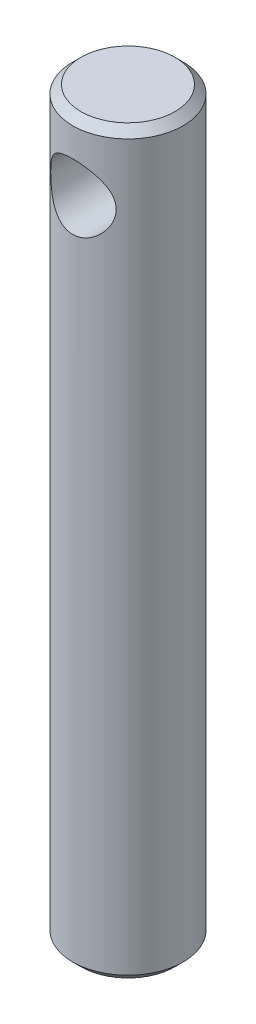
ISO-10303-21;
HEADER;
FILE_DESCRIPTION(('STEP AP214'),'2;1');
FILE_NAME('part.step','',(''),(''),'','','');
FILE_SCHEMA(('AUTOMOTIVE_DESIGN { 1 0 10303 214 1 1 1 1 }'));
ENDSEC;
DATA;
#1=APPLICATION_CONTEXT('core data for automotive mechanical design processes');
#2=APPLICATION_PROTOCOL_DEFINITION('international standard','automotive_design',2000,#1);
#3=PRODUCT_CONTEXT('',#1,'mechanical');
#4=PRODUCT('Part','Part','',(#3));
#5=PRODUCT_RELATED_PRODUCT_CATEGORY('part','',(#4));
#6=PRODUCT_DEFINITION_FORMATION('','',#4);
#7=PRODUCT_DEFINITION_CONTEXT('part definition',#1,'design');
#8=PRODUCT_DEFINITION('design','',#6,#7);
#9=PRODUCT_DEFINITION_SHAPE('','',#8);
#10=(LENGTH_UNIT() NAMED_UNIT(*) SI_UNIT(.MILLI.,.METRE.));
#11=(NAMED_UNIT(*) PLANE_ANGLE_UNIT() SI_UNIT($,.RADIAN.));
#12=(NAMED_UNIT(*) SI_UNIT($,.STERADIAN.) SOLID_ANGLE_UNIT());
#13=UNCERTAINTY_MEASURE_WITH_UNIT(LENGTH_MEASURE(1.E-05),#10,'distance_accuracy_value','');
#14=(GEOMETRIC_REPRESENTATION_CONTEXT(3) GLOBAL_UNCERTAINTY_ASSIGNED_CONTEXT((#13)) GLOBAL_UNIT_ASSIGNED_CONTEXT((#10,
#11,#12)) REPRESENTATION_CONTEXT('',''));
#15=CARTESIAN_POINT('',(0.,0.,0.));
#16=DIRECTION('',(0.,0.,1.));
#17=DIRECTION('',(1.,0.,0.));
#18=AXIS2_PLACEMENT_3D('',#15,#16,#17);
#19=CARTESIAN_POINT('',(0.,181.,0.));
#20=DIRECTION('',(0.,-1.,0.));
#21=DIRECTION('',(0.,0.,-1.));
#22=AXIS2_PLACEMENT_3D('',#19,#20,#21);
#23=CYLINDRICAL_SURFACE('',#22,13.5);
#24=CARTESIAN_POINT('',(0.,179.,0.));
#25=DIRECTION('',(0.,1.,0.));
#26=DIRECTION('',(0.,0.,1.));
#27=AXIS2_PLACEMENT_3D('',#24,#25,#26);
#28=CIRCLE('',#27,13.5);
#29=CARTESIAN_POINT('',(0.,179.,13.5));
#30=VERTEX_POINT('',#29);
#31=EDGE_CURVE('E38',#30,#30,#28,.F.);
#32=ORIENTED_EDGE('',*,*,#31,.T.);
#33=EDGE_LOOP('',(#32));
#34=FACE_BOUND('',#33,.T.);
#35=CARTESIAN_POINT('',(0.,2.00000000000003,0.));
#36=DIRECTION('',(0.,1.,0.));
#37=DIRECTION('',(0.,0.,1.));
#38=AXIS2_PLACEMENT_3D('',#35,#36,#37);
#39=CIRCLE('',#38,13.5);
#40=CARTESIAN_POINT('',(0.,2.00000000000003,13.5));
#41=VERTEX_POINT('',#40);
#42=EDGE_CURVE('E42',#41,#41,#39,.T.);
#43=ORIENTED_EDGE('',*,*,#42,.T.);
#44=EDGE_LOOP('',(#43));
#45=FACE_BOUND('',#44,.T.);
#46=CARTESIAN_POINT('',(0.,172.,-13.5));
#47=CARTESIAN_POINT('',(-0.205122931176953,171.999998343756,-13.4999984706654));
#48=CARTESIAN_POINT('',(-0.41030968731953,171.992098137591,-13.4953127723332));
#49=CARTESIAN_POINT('',(-0.819141753344273,171.960595967104,-13.4766810212997));
#50=CARTESIAN_POINT('',(-1.02278601232819,171.936984128209,-13.4627291449269));
#51=CARTESIAN_POINT('',(-1.42728944357704,171.874313427976,-13.4258768138681));
#52=CARTESIAN_POINT('',(-1.6281421212592,171.835223299433,-13.4029582469779));
#53=CARTESIAN_POINT('',(-2.02526903490091,171.742086703841,-13.3487255680575));
#54=CARTESIAN_POINT('',(-2.22154127118509,171.688033832243,-13.3174078610974));
#55=CARTESIAN_POINT('',(-2.60710044914416,171.56595647582,-13.2473097212851));
#56=CARTESIAN_POINT('',(-2.796419526404,171.49800942811,-13.2085707223819));
#57=CARTESIAN_POINT('',(-3.16819309454816,171.348653371793,-13.1243629595229));
#58=CARTESIAN_POINT('',(-3.35064490164154,171.267239165798,-13.0788915980566));
#59=CARTESIAN_POINT('',(-3.70759632054505,171.091773017542,-12.9822141132811));
#60=CARTESIAN_POINT('',(-3.88210196567982,170.997730885075,-12.9310124465547));
#61=CARTESIAN_POINT('',(-4.22262062146871,170.797683998483,-12.8238603317318));
#62=CARTESIAN_POINT('',(-4.38863046858383,170.691674834685,-12.7679081350303));
#63=CARTESIAN_POINT('',(-4.89718414110189,170.339996691162,-12.5858330445618));
#64=CARTESIAN_POINT('',(-5.22341790700595,170.07380246969,-12.4529468182507));
#65=CARTESIAN_POINT('',(-5.82936656276921,169.494946649173,-12.1810937765254));
#66=CARTESIAN_POINT('',(-6.10902175775847,169.182226379139,-12.0421194422138));
#67=CARTESIAN_POINT('',(-6.50520782052547,168.662327776831,-11.8303992839742));
#68=CARTESIAN_POINT('',(-6.63936720209023,168.469263745104,-11.7554216876498));
#69=CARTESIAN_POINT('',(-6.89086522885866,168.070807118774,-11.609783433664));
#70=CARTESIAN_POINT('',(-7.00820120063712,167.865412572059,-11.5391234631425));
#71=CARTESIAN_POINT('',(-7.22484399489973,167.443515156213,-11.4047302769881));
#72=CARTESIAN_POINT('',(-7.32417406468948,167.227027080084,-11.3409881730563));
#73=CARTESIAN_POINT('',(-7.50381963098545,166.783846649798,-11.222934423756));
#74=CARTESIAN_POINT('',(-7.58414199724749,166.557158017684,-11.1686193731639));
#75=CARTESIAN_POINT('',(-7.70795943714298,166.14973876555,-11.0833927077012));
#76=CARTESIAN_POINT('',(-7.75567185156902,165.970802408651,-11.0499835537045));
#77=CARTESIAN_POINT('',(-7.83876309883677,165.608806310971,-10.991196056065));
#78=CARTESIAN_POINT('',(-7.87414459111242,165.425747468372,-10.9658159808844));
#79=CARTESIAN_POINT('',(-7.93208960481248,165.056783615112,-10.9239752592024));
#80=CARTESIAN_POINT('',(-7.95466580537517,164.87088160762,-10.9075057906269));
#81=CARTESIAN_POINT('',(-7.98672547282611,164.497345023897,-10.8840532203254));
#82=CARTESIAN_POINT('',(-7.9962087034115,164.309710416457,-10.8770702898131));
#83=CARTESIAN_POINT('',(-8.00193828874021,163.93379097889,-10.8728559818045));
#84=CARTESIAN_POINT('',(-7.99816084764291,163.745505586187,-10.8756421345971));
#85=CARTESIAN_POINT('',(-7.97737627294427,163.370065949334,-10.8908967202689));
#86=CARTESIAN_POINT('',(-7.96036907765031,163.182911710462,-10.9033651982984));
#87=CARTESIAN_POINT('',(-7.91337303541688,162.811019662174,-10.9375210319713));
#88=CARTESIAN_POINT('',(-7.88337852601511,162.626282943032,-10.9592124087194));
#89=CARTESIAN_POINT('',(-7.81080898822978,162.260442530172,-11.0110510917449));
#90=CARTESIAN_POINT('',(-7.76822883364468,162.079340348982,-11.041201843317));
#91=CARTESIAN_POINT('',(-7.67153392214045,161.723788188133,-11.1086001105235));
#92=CARTESIAN_POINT('',(-7.61754951032849,161.549287312154,-11.1457669635967));
#93=CARTESIAN_POINT('',(-7.49830790922819,161.205633614546,-11.2263329483964));
#94=CARTESIAN_POINT('',(-7.43304703041514,161.036482564811,-11.2697341191304));
#95=CARTESIAN_POINT('',(-7.22117432928156,160.538074590643,-11.4075872311667));
#96=CARTESIAN_POINT('',(-7.05842398146661,160.21768715253,-11.5097240115744));
#97=CARTESIAN_POINT('',(-6.66247402643238,159.551838280788,-11.7440543621879));
#98=CARTESIAN_POINT('',(-6.42198486582338,159.211467447191,-11.878400495209));
#99=CARTESIAN_POINT('',(-6.02466132616968,158.732497566782,-12.0820427711885));
#100=CARTESIAN_POINT('',(-5.8860016140811,158.57799915745,-12.1503304832045));
#101=CARTESIAN_POINT('',(-5.59686531747621,158.280018656814,-12.28619478169));
#102=CARTESIAN_POINT('',(-5.44638665906638,158.13653850768,-12.353771240985));
#103=CARTESIAN_POINT('',(-5.11342266365443,157.843012578185,-12.4955936502826));
#104=CARTESIAN_POINT('',(-4.92934072005561,157.694625523672,-12.5695334520902));
#105=CARTESIAN_POINT('',(-4.54760991273903,157.414005009921,-12.7126224432407));
#106=CARTESIAN_POINT('',(-4.34996643209304,157.281765198526,-12.7817735117576));
#107=CARTESIAN_POINT('',(-3.94205841605495,157.034583098467,-12.9134074362129));
#108=CARTESIAN_POINT('',(-3.73179575996589,156.91963824306,-12.9758912812324));
#109=CARTESIAN_POINT('',(-3.29988979614193,156.708326471527,-13.0923920961945));
#110=CARTESIAN_POINT('',(-3.07824791157265,156.611957239337,-13.1464101215234));
#111=CARTESIAN_POINT('',(-2.63989262491529,156.444712590565,-13.2411455573001));
#112=CARTESIAN_POINT('',(-2.42379373851599,156.37258808913,-13.2824988684139));
#113=CARTESIAN_POINT('',(-1.98464521869016,156.246720575252,-13.3551749407203));
#114=CARTESIAN_POINT('',(-1.76159580134516,156.192976991994,-13.3864980133972));
#115=CARTESIAN_POINT('',(-1.31067843201882,156.104757850273,-13.4381386306378));
#116=CARTESIAN_POINT('',(-1.08281526319762,156.070264020151,-13.4584666110582));
#117=CARTESIAN_POINT('',(-0.624238580697285,156.021060133653,-13.4875157829987));
#118=CARTESIAN_POINT('',(-0.393525449189458,156.006347453135,-13.4962385140549));
#119=CARTESIAN_POINT('',(0.0378766724428281,155.997576776386,-13.5014361348051));
#120=CARTESIAN_POINT('',(0.238502954909073,156.001045490512,-13.4993776671767));
#121=CARTESIAN_POINT('',(0.638640809631498,156.023015763461,-13.4863707718972));
#122=CARTESIAN_POINT('',(0.83815241341006,156.041516894989,-13.4754225969356));
#123=CARTESIAN_POINT('',(1.23455794778156,156.093305143134,-13.4449019138791));
#124=CARTESIAN_POINT('',(1.43145203899232,156.126591348145,-13.4253299375047));
#125=CARTESIAN_POINT('',(1.8212613679895,156.207526758632,-13.3780253653781));
#126=CARTESIAN_POINT('',(2.01417650025616,156.255176344495,-13.3502925535022));
#127=CARTESIAN_POINT('',(2.39085762808705,156.363156275801,-13.287944824429));
#128=CARTESIAN_POINT('',(2.57473032701229,156.423203983128,-13.2534841015468));
#129=CARTESIAN_POINT('',(2.93650337424314,156.555933754035,-13.1780558295579));
#130=CARTESIAN_POINT('',(3.11440174298448,156.628619956985,-13.1370861490134));
#131=CARTESIAN_POINT('',(3.63772021230858,156.864649779632,-13.0056152632673));
#132=CARTESIAN_POINT('',(3.97303694654272,157.046043984512,-12.9065051976664));
#133=CARTESIAN_POINT('',(4.64414667633845,157.472644541888,-12.6814886425768));
#134=CARTESIAN_POINT('',(4.97635388183319,157.72252860721,-12.5538665397381));
#135=CARTESIAN_POINT('',(5.59683667009505,158.268822776691,-12.2897974702756));
#136=CARTESIAN_POINT('',(5.88506021395217,158.565287163469,-12.1533403181474));
#137=CARTESIAN_POINT('',(6.29750224230009,159.060824047299,-11.9423385209066));
#138=CARTESIAN_POINT('',(6.43837099779288,159.245881454074,-11.8667829553649));
#139=CARTESIAN_POINT('',(6.70403303829135,159.628483436868,-11.7187468487953));
#140=CARTESIAN_POINT('',(6.82882379796972,159.826029967273,-11.6462667920254));
#141=CARTESIAN_POINT('',(7.06125094454739,160.232570680755,-11.506828543792));
#142=CARTESIAN_POINT('',(7.16890262366968,160.441554432744,-11.4398654558908));
#143=CARTESIAN_POINT('',(7.36611990231878,160.87016326196,-11.3138841290262));
#144=CARTESIAN_POINT('',(7.45569130340101,161.089784897592,-11.254863343589));
#145=CARTESIAN_POINT('',(7.59831555682667,161.489927623979,-11.1589116515974));
#146=CARTESIAN_POINT('',(7.6550774522513,161.668649814471,-11.1199628798627));
#147=CARTESIAN_POINT('',(7.75617019210318,162.030949498007,-11.0496885843208));
#148=CARTESIAN_POINT('',(7.80050860145053,162.214523961541,-11.0183584229255));
#149=CARTESIAN_POINT('',(7.87621469797195,162.585421878416,-10.9643699469353));
#150=CARTESIAN_POINT('',(7.90759396053869,162.772741828694,-10.9417038947219));
#151=CARTESIAN_POINT('',(7.95699523265756,163.150046162119,-10.9058316583184));
#152=CARTESIAN_POINT('',(7.97501712893094,163.340030567848,-10.8926255543545));
#153=CARTESIAN_POINT('',(7.99745812033671,163.721867736,-10.8761602279497));
#154=CARTESIAN_POINT('',(8.0018321124445,163.913724595854,-10.8729339868456));
#155=CARTESIAN_POINT('',(7.996778112766,164.297156559766,-10.8766515466055));
#156=CARTESIAN_POINT('',(7.98735008406233,164.488731663069,-10.8835953746723));
#157=CARTESIAN_POINT('',(7.95483727212307,164.870187875616,-10.9073812508997));
#158=CARTESIAN_POINT('',(7.93174562421614,165.060068084629,-10.9242282744479));
#159=CARTESIAN_POINT('',(7.87225290532894,165.436655864536,-10.9671771278067));
#160=CARTESIAN_POINT('',(7.8358517253291,165.62336340943,-10.9932790334249));
#161=CARTESIAN_POINT('',(7.75194341298969,165.985057252961,-11.0525969465292));
#162=CARTESIAN_POINT('',(7.70493742499578,166.160213974115,-11.08548750366));
#163=CARTESIAN_POINT('',(7.59961179114273,166.505702153153,-11.1579558738974));
#164=CARTESIAN_POINT('',(7.54128831449775,166.676031954767,-11.1975359507106));
#165=CARTESIAN_POINT('',(7.35014402665028,167.178647907142,-11.3247003980992));
#166=CARTESIAN_POINT('',(7.20110593141274,167.50274480264,-11.4207410887993));
#167=CARTESIAN_POINT('',(6.83759533101134,168.173054345092,-11.6425574956993));
#168=CARTESIAN_POINT('',(6.61656952026615,168.514942501525,-11.7706347614511));
#169=CARTESIAN_POINT('',(6.24942221440434,168.998577087836,-11.9672101055936));
#170=CARTESIAN_POINT('',(6.12100398845157,169.155020281687,-12.0335258078162));
#171=CARTESIAN_POINT('',(5.85266870926556,169.457762676791,-12.1662915906787));
#172=CARTESIAN_POINT('',(5.71274980853131,169.604060241233,-12.2327416912298));
#173=CARTESIAN_POINT('',(5.39961220618118,169.907515499742,-12.3744932154749));
#174=CARTESIAN_POINT('',(5.22457710182641,170.062899085935,-12.4495896248399));
#175=CARTESIAN_POINT('',(4.86068650491977,170.358351172896,-12.5961177516525));
#176=CARTESIAN_POINT('',(4.67183545178349,170.498424557454,-12.6675506338437));
#177=CARTESIAN_POINT('',(4.28098686300632,170.762305913232,-12.8049241695868));
#178=CARTESIAN_POINT('',(4.07898067749008,170.886103017518,-12.8708611431256));
#179=CARTESIAN_POINT('',(3.66302585983883,171.116087339016,-12.9953588122696));
#180=CARTESIAN_POINT('',(3.44907886127284,171.222276957175,-13.0539205133004));
#181=CARTESIAN_POINT('',(3.01899528399244,171.412069673333,-13.1598943889411));
#182=CARTESIAN_POINT('',(2.80325651083393,171.496382150513,-13.2076477255457));
#183=CARTESIAN_POINT('',(2.3635401937516,171.646411905496,-13.2933751193557));
#184=CARTESIAN_POINT('',(2.13956422012373,171.712132706965,-13.3313510295467));
#185=CARTESIAN_POINT('',(1.6859447781057,171.823808893193,-13.3962654258179));
#186=CARTESIAN_POINT('',(1.45632169501933,171.869826733885,-13.4232387755874));
#187=CARTESIAN_POINT('',(0.99299642917018,171.941588156701,-13.4654361798352));
#188=CARTESIAN_POINT('',(0.759297932027849,171.967349175702,-13.4806703390683));
#189=CARTESIAN_POINT('',(0.437483109511527,171.988509304819,-13.49319343359));
#190=CARTESIAN_POINT('',(0.350067216041171,171.99281650967,-13.4957441886123));
#191=CARTESIAN_POINT('',(0.175104760066545,171.998562242503,-13.4991478170144));
#192=CARTESIAN_POINT('',(0.0875581947125264,172.00000070698,-13.5000006528074));
#193=CARTESIAN_POINT('',(0.,172.,-13.5));
#194=B_SPLINE_CURVE_WITH_KNOTS('',3,(#46,#47,#48,#49,#50,#51,#52,#53,#54,#55,#56,#57,#58,#59,
#60,#61,#62,#63,#64,#65,#66,#67,#68,#69,#70,#71,#72,#73,#74,#75,#76,#77,#78,#79,#80,#81,#82,#83,
#84,#85,#86,#87,#88,#89,#90,#91,#92,#93,#94,#95,#96,#97,#98,#99,#100,#101,#102,#103,#104,#105,
#106,#107,#108,#109,#110,#111,#112,#113,#114,#115,#116,#117,#118,#119,#120,#121,#122,#123,#124,
#125,#126,#127,#128,#129,#130,#131,#132,#133,#134,#135,#136,#137,#138,#139,#140,#141,#142,#143,
#144,#145,#146,#147,#148,#149,#150,#151,#152,#153,#154,#155,#156,#157,#158,#159,#160,#161,#162,
#163,#164,#165,#166,#167,#168,#169,#170,#171,#172,#173,#174,#175,#176,#177,#178,#179,#180,#181,
#182,#183,#184,#185,#186,#187,#188,#189,#190,#191,#192,#193),.UNSPECIFIED.,.T.,.F.,(4,2,2,2,2,2,
2,2,2,2,2,2,2,2,2,2,2,2,2,2,2,2,2,2,2,2,2,2,2,2,2,2,2,2,2,2,2,2,2,2,2,2,2,2,2,2,2,2,2,2,2,2,2,2,
2,2,2,2,2,2,2,2,2,2,2,2,2,2,2,2,2,2,2,4),(0.,0.615275484959753,1.2309380288884,1.84785065057618,
2.46502774062068,3.07885451234465,3.69291873363487,4.30650865972086,4.92032542722164,
6.2393614559817,7.56007515979932,8.29959614649735,9.03923452128919,9.77791104447759,
10.5163201863829,11.0802870514803,11.6441322093692,12.2074180979311,12.7707141525833,
13.3350215398412,13.899331558577,14.4638878643332,15.0286744345495,15.5873248189246,
16.1461583343158,17.2632738786723,18.5715457407466,19.226685801289,19.8819410784707,
20.6242194231251,21.3662048159257,22.1080799818841,22.849862588722,23.5434781118216,
24.2370720929322,24.9300065974601,25.6228491690924,26.2241032615038,26.8253402638966,
27.4265402008261,28.0277560607945,28.6165378710193,29.2055128839596,30.3826068702004,
31.6822635868828,32.9834462549485,33.7163353828148,34.449339483624,35.1816858564231,
35.9137968608352,36.4877987881715,37.0614504303847,37.6345885603748,38.2077315508767,
38.7827666451384,39.3578032774961,39.933129056755,40.508459548665,41.0608316518111,
41.6133910510986,42.7179397420538,43.9932133815707,44.6317328260275,45.2703550452832,
46.0068938813791,46.7431970796167,47.4799894044086,48.2166811778527,48.9251533770453,
49.6334912099232,50.3395667710115,51.0450338817081,51.3076628226638,51.5702975773684),.UNSPECIFIED.);
#195=CARTESIAN_POINT('',(0.,172.,-13.5));
#196=VERTEX_POINT('',#195);
#197=EDGE_CURVE('E51',#196,#196,#194,.T.);
#198=ORIENTED_EDGE('',*,*,#197,.T.);
#199=EDGE_LOOP('',(#198));
#200=FACE_BOUND('',#199,.T.);
#201=CARTESIAN_POINT('',(8.00000000000001,164.,10.8742815854658));
#202=CARTESIAN_POINT('',(8.00000066972052,163.79812704354,10.8742806182195));
#203=CARTESIAN_POINT('',(7.99234765156945,163.596261882585,10.8799236092202));
#204=CARTESIAN_POINT('',(7.9618767460872,163.194306900145,10.9022416615778));
#205=CARTESIAN_POINT('',(7.93905932909489,162.994217023794,10.9189163807748));
#206=CARTESIAN_POINT('',(7.8786220567898,162.59726566884,10.9626044886695));
#207=CARTESIAN_POINT('',(7.84098902590663,162.400407226732,10.9896270791748));
#208=CARTESIAN_POINT('',(7.75149354207312,162.011489183875,11.0529337378418));
#209=CARTESIAN_POINT('',(7.69963048168376,161.819429788364,11.0892182013616));
#210=CARTESIAN_POINT('',(7.58277091402705,161.442616047927,11.1694477063965));
#211=CARTESIAN_POINT('',(7.51787344274849,161.257818482169,11.2133346573902));
#212=CARTESIAN_POINT('',(7.37537290766848,160.894856217774,11.3075714777897));
#213=CARTESIAN_POINT('',(7.29776487969247,160.716694144164,11.3579238706415));
#214=CARTESIAN_POINT('',(7.04689046357688,160.193297536408,11.5165294322246));
#215=CARTESIAN_POINT('',(6.85549612730818,159.858905864772,11.6323867756658));
#216=CARTESIAN_POINT('',(6.40338137662063,159.185411262126,11.8878805091604));
#217=CARTESIAN_POINT('',(6.13712303966875,158.850478148087,12.0287061960164));
#218=CARTESIAN_POINT('',(5.70026551841605,158.382833652492,12.238596600125));
#219=CARTESIAN_POINT('',(5.54828398649881,158.232653451382,12.30838287456));
#220=CARTESIAN_POINT('',(5.23223995619098,157.944474498362,12.4460168052709));
#221=CARTESIAN_POINT('',(5.06817537137077,157.806477859324,12.5138641239187));
#222=CARTESIAN_POINT('',(4.71078077135598,157.529694730334,12.6530264824128));
#223=CARTESIAN_POINT('',(4.51618624394189,157.39234424597,12.7239585619106));
#224=CARTESIAN_POINT('',(4.11404786927373,157.134754835067,12.8596115402171));
#225=CARTESIAN_POINT('',(3.90650982369292,157.014508320187,12.9243351892788));
#226=CARTESIAN_POINT('',(3.47967167743079,156.792383391821,13.0457307108672));
#227=CARTESIAN_POINT('',(3.26037650231535,156.690497363164,13.1024059194772));
#228=CARTESIAN_POINT('',(2.81147420129086,156.506373608097,13.2060077355363));
#229=CARTESIAN_POINT('',(2.58186872600857,156.424132749824,13.2529358967187));
#230=CARTESIAN_POINT('',(2.13613591346709,156.287278218098,13.331663463081));
#231=CARTESIAN_POINT('',(1.92075815409438,156.230799328474,13.3644676910051));
#232=CARTESIAN_POINT('',(1.48477800210823,156.135828562779,13.4198994564764));
#233=CARTESIAN_POINT('',(1.2641759075851,156.097335663049,13.4425275731869));
#234=CARTESIAN_POINT('',(0.819850673621884,156.038968889252,13.476923262792));
#235=CARTESIAN_POINT('',(0.596130033507574,156.019080887432,13.4886990763538));
#236=CARTESIAN_POINT('',(0.147508331015898,155.998209643094,13.5010582768779));
#237=CARTESIAN_POINT('',(-0.0773926134354512,155.997224546618,13.5016427614625));
#238=CARTESIAN_POINT('',(-0.498981178808983,156.013137267787,13.4922181317775));
#239=CARTESIAN_POINT('',(-0.695783248493347,156.027881250192,13.4834849070384));
#240=CARTESIAN_POINT('',(-1.08721419571641,156.071775353704,13.4575789196586));
#241=CARTESIAN_POINT('',(-1.28184308034781,156.100925427779,13.4404061845703));
#242=CARTESIAN_POINT('',(-1.66756943769057,156.173268843967,13.3980171261845));
#243=CARTESIAN_POINT('',(-1.85866695777902,156.216461997532,13.372800910882));
#244=CARTESIAN_POINT('',(-2.2361234588293,156.316389220463,13.314887101475));
#245=CARTESIAN_POINT('',(-2.42248224563113,156.373123843679,13.2821892013707));
#246=CARTESIAN_POINT('',(-2.79057204079765,156.499944331085,13.2097730947892));
#247=CARTESIAN_POINT('',(-2.97226587515725,156.570113180647,13.1700113701964));
#248=CARTESIAN_POINT('',(-3.32888629912084,156.722899320055,13.0844259940756));
#249=CARTESIAN_POINT('',(-3.50381060615085,156.805520763535,13.0386003205079));
#250=CARTESIAN_POINT('',(-4.01716303753443,157.071028634323,12.89335404919));
#251=CARTESIAN_POINT('',(-4.34441275526407,157.271642979083,12.7861147782938));
#252=CARTESIAN_POINT('',(-5.00040625183952,157.740807442118,12.5452081962363));
#253=CARTESIAN_POINT('',(-5.32478086132632,158.014577588094,12.4099157432865));
#254=CARTESIAN_POINT('',(-5.92590775019196,158.609043121832,12.1343708755145));
#255=CARTESIAN_POINT('',(-6.20259615183106,158.929800403741,11.9941121064637));
#256=CARTESIAN_POINT('',(-6.5919885763887,159.461150007594,11.7822287770144));
#257=CARTESIAN_POINT('',(-6.72298011210512,159.6574734322,11.7077644637116));
#258=CARTESIAN_POINT('',(-6.96784464263484,160.062350390613,11.5637055699648));
#259=CARTESIAN_POINT('',(-7.08171493975028,160.27090584457,11.4941117578599));
#260=CARTESIAN_POINT('',(-7.29106134639144,160.69892332292,11.3624693916631));
#261=CARTESIAN_POINT('',(-7.38656490508983,160.918368445308,11.3004096299017));
#262=CARTESIAN_POINT('',(-7.55818112446817,161.367214160588,11.1863546128059));
#263=CARTESIAN_POINT('',(-7.63430119111731,161.596610911874,11.1343555153616));
#264=CARTESIAN_POINT('',(-7.74992532438251,162.006909127494,11.0540639339352));
#265=CARTESIAN_POINT('',(-7.79383229608196,162.186054526585,11.023081108003));
#266=CARTESIAN_POINT('',(-7.86932166237167,162.548121215735,10.9693177627054));
#267=CARTESIAN_POINT('',(-7.90090669929916,162.731041687392,10.9465354848813));
#268=CARTESIAN_POINT('',(-7.95131211026935,163.099359537829,10.9099774759348));
#269=CARTESIAN_POINT('',(-7.97014415742281,163.284754492691,10.8961935088648));
#270=CARTESIAN_POINT('',(-7.99481308481208,163.656878721409,10.8781064860126));
#271=CARTESIAN_POINT('',(-8.00064967259347,163.8436080252,10.873803643597));
#272=CARTESIAN_POINT('',(-7.99923476688472,164.217202907764,10.8748445425118));
#273=CARTESIAN_POINT('',(-7.99196832686485,164.404068398809,10.8801993001988));
#274=CARTESIAN_POINT('',(-7.9644313000392,164.776317532398,10.9003725691683));
#275=CARTESIAN_POINT('',(-7.94416064970172,164.9617011677,10.915191126686));
#276=CARTESIAN_POINT('',(-7.89090068651351,165.329768336659,10.9537556351855));
#277=CARTESIAN_POINT('',(-7.85790542157276,165.512450565116,10.9775057638867));
#278=CARTESIAN_POINT('',(-7.77961996656757,165.873963430057,11.0331234807391));
#279=CARTESIAN_POINT('',(-7.73432477346561,166.052792467224,11.0649943717118));
#280=CARTESIAN_POINT('',(-7.63185057112619,166.40598039553,11.1359212687022));
#281=CARTESIAN_POINT('',(-7.57464583897914,166.580328677754,11.1749928057706));
#282=CARTESIAN_POINT('',(-7.44895405973558,166.923437859466,11.2591652146268));
#283=CARTESIAN_POINT('',(-7.38046330855397,167.092196902647,11.3042680649797));
#284=CARTESIAN_POINT('',(-7.15889310498912,167.589116485458,11.4468819902924));
#285=CARTESIAN_POINT('',(-6.9896662969808,167.908087496684,11.5517340857843));
#286=CARTESIAN_POINT('',(-6.57850256752419,168.571820423671,11.7914923852851));
#287=CARTESIAN_POINT('',(-6.3289996236535,168.911167596101,11.928434332397));
#288=CARTESIAN_POINT('',(-5.91772228860949,169.387453996077,12.1348364567161));
#289=CARTESIAN_POINT('',(-5.77433409613031,169.540866357154,12.2038557967721));
#290=CARTESIAN_POINT('',(-5.47560471247901,169.836254403276,12.340774507865));
#291=CARTESIAN_POINT('',(-5.3202614430214,169.978228090986,12.4086736816681));
#292=CARTESIAN_POINT('',(-4.97851669349687,170.266600720948,12.5500046277098));
#293=CARTESIAN_POINT('',(-4.7906395365872,170.411420708276,12.6230986836248));
#294=CARTESIAN_POINT('',(-4.40149316231169,170.684559456021,12.7639983631136));
#295=CARTESIAN_POINT('',(-4.20022950793764,170.812885006773,12.8318061583519));
#296=CARTESIAN_POINT('',(-3.78534019926851,171.051842775308,12.9602599950957));
#297=CARTESIAN_POINT('',(-3.5717178369457,171.16247967551,13.0209079307949));
#298=CARTESIAN_POINT('',(-3.13341828413445,171.364775729557,13.1332724158548));
#299=CARTESIAN_POINT('',(-2.90874262144533,171.456437497095,13.1849901951198));
#300=CARTESIAN_POINT('',(-2.46734890598544,171.613332795733,13.2743739395445));
#301=CARTESIAN_POINT('',(-2.25130947404956,171.680038539342,13.3128057027469));
#302=CARTESIAN_POINT('',(-1.81287463449183,171.795180603957,13.3795603882069));
#303=CARTESIAN_POINT('',(-1.59047948377261,171.843617662276,13.4078837184322));
#304=CARTESIAN_POINT('',(-1.1414635445308,171.921422373528,13.4535475042529));
#305=CARTESIAN_POINT('',(-0.914846678555949,171.950806900586,13.4708976780336));
#306=CARTESIAN_POINT('',(-0.459353740993109,171.990070528567,13.4941087787144));
#307=CARTESIAN_POINT('',(-0.230477946359051,171.999951991509,13.4999710969101));
#308=CARTESIAN_POINT('',(0.197680118516688,172.000041501162,13.5000249883105));
#309=CARTESIAN_POINT('',(0.396966811714394,171.992625547187,13.4956260550064));
#310=CARTESIAN_POINT('',(0.79404902871854,171.962984164389,13.4780922883792));
#311=CARTESIAN_POINT('',(0.991844581780708,171.940759026888,13.464957626902));
#312=CARTESIAN_POINT('',(1.38449237558049,171.881788892737,13.4302654187407));
#313=CARTESIAN_POINT('',(1.57934473833651,171.84504449975,13.408708222238));
#314=CARTESIAN_POINT('',(1.96479894084894,171.757488806792,13.3576707928985));
#315=CARTESIAN_POINT('',(2.15540064432288,171.706677056498,13.3281903064238));
#316=CARTESIAN_POINT('',(2.52904954643743,171.592209554795,13.2623330300385));
#317=CARTESIAN_POINT('',(2.71215792068127,171.528706066766,13.2260382775582));
#318=CARTESIAN_POINT('',(3.07212970583999,171.389136159315,13.1470923043903));
#319=CARTESIAN_POINT('',(3.24899103487614,171.313065598876,13.1044389889261));
#320=CARTESIAN_POINT('',(3.76884437030429,171.067007700868,12.9681851526297));
#321=CARTESIAN_POINT('',(4.10136564669907,170.879093513504,12.8662431542773));
#322=CARTESIAN_POINT('',(4.76742535868178,170.438050562857,12.6356378586303));
#323=CARTESIAN_POINT('',(5.09710295464033,170.180038911923,12.5052718000994));
#324=CARTESIAN_POINT('',(5.71126284959761,169.61738574987,12.2369841317398));
#325=CARTESIAN_POINT('',(5.99569258993648,169.312690807303,12.0990539820591));
#326=CARTESIAN_POINT('',(6.40057894634098,168.804904785338,11.8873747100098));
#327=CARTESIAN_POINT('',(6.5382152091188,168.615909381138,11.8120248314661));
#328=CARTESIAN_POINT('',(6.79705102125055,168.225508749341,11.664999565969));
#329=CARTESIAN_POINT('',(6.91824845718305,168.02410193093,11.5933246522146));
#330=CARTESIAN_POINT('',(7.14312334989106,167.6098893522,11.456140046272));
#331=CARTESIAN_POINT('',(7.24681106818963,167.397090365218,11.3906267531271));
#332=CARTESIAN_POINT('',(7.43563389212613,166.961039077412,11.2682745881675));
#333=CARTESIAN_POINT('',(7.52077447936095,166.737789888903,11.2114331548805));
#334=CARTESIAN_POINT('',(7.66192952586809,166.310614920417,11.115358508138));
#335=CARTESIAN_POINT('',(7.72025108445344,166.107746528283,11.0748138677424));
#336=CARTESIAN_POINT('',(7.8209216505827,165.696455104954,11.003953082215));
#337=CARTESIAN_POINT('',(7.86328184221094,165.488036073125,10.9736297765997));
#338=CARTESIAN_POINT('',(7.93132977061989,165.067398152432,10.9245492339336));
#339=CARTESIAN_POINT('',(7.95703794754929,164.85518425196,10.9057778184951));
#340=CARTESIAN_POINT('',(7.99137217134949,164.428643883396,10.8806448966478));
#341=CARTESIAN_POINT('',(7.99999928899414,164.214317548575,10.8742826123385));
#342=CARTESIAN_POINT('',(8.00000000000001,164.,10.8742815854658));
#343=B_SPLINE_CURVE_WITH_KNOTS('',3,(#201,#202,#203,#204,#205,#206,#207,#208,#209,#210,#211,
#212,#213,#214,#215,#216,#217,#218,#219,#220,#221,#222,#223,#224,#225,#226,#227,#228,#229,#230,
#231,#232,#233,#234,#235,#236,#237,#238,#239,#240,#241,#242,#243,#244,#245,#246,#247,#248,#249,
#250,#251,#252,#253,#254,#255,#256,#257,#258,#259,#260,#261,#262,#263,#264,#265,#266,#267,#268,
#269,#270,#271,#272,#273,#274,#275,#276,#277,#278,#279,#280,#281,#282,#283,#284,#285,#286,#287,
#288,#289,#290,#291,#292,#293,#294,#295,#296,#297,#298,#299,#300,#301,#302,#303,#304,#305,#306,
#307,#308,#309,#310,#311,#312,#313,#314,#315,#316,#317,#318,#319,#320,#321,#322,#323,#324,#325,
#326,#327,#328,#329,#330,#331,#332,#333,#334,#335,#336,#337,#338,#339,#340,#341,#342),
.UNSPECIFIED.,.T.,.F.,(4,2,2,2,2,2,2,2,2,2,2,2,2,2,2,2,2,2,2,2,2,2,2,2,2,2,2,2,2,2,2,2,2,2,2,2,
2,2,2,2,2,2,2,2,2,2,2,2,2,2,2,2,2,2,2,2,2,2,2,2,2,2,2,2,2,2,2,2,2,2,4),(0.,0.60538490241765,
1.21075102909758,1.81665673023765,2.4225882997738,3.0240792074092,3.62580559312916,
4.82847285497901,6.17417937603745,6.84795934685348,7.52185593599958,8.2664525218009,
9.01071772289363,9.75467351949461,10.4985106342443,11.172735507268,11.8469220025916,
12.5205961333696,13.1942041912463,13.7861367238973,14.3780673240749,14.9699899770893,
15.5619368439831,16.1576656669695,16.7535936402505,17.9446744621887,19.2761272558962,
20.6093499551275,21.3510087265421,22.0927842347977,22.8334423912876,23.5738171339452,
24.1343422896619,24.6947471792257,25.2546384212,25.8145422630373,26.3750851872347,
26.9356308499687,27.4964390332656,28.0574756697668,28.6197368760631,29.182182986061,
30.306544172607,31.6297454331614,32.2923718365374,32.9551136930539,33.6988349563788,
34.4422490614601,35.185466048011,35.9285805933436,36.6156268370088,37.3026453489505,
37.9890545597267,38.6753806342599,39.2730677897657,39.870743188148,40.4683937397935,
41.066063425539,41.6569521961063,42.2480360621018,43.4293837337968,44.7398453384579,
46.0518181963849,46.7880037751724,47.5242839105027,48.2601310419913,48.9957603982155,
49.6397484681409,50.283284454608,50.926029003833,51.5687332595471),.UNSPECIFIED.);
#344=CARTESIAN_POINT('',(8.00000000000001,164.,10.8742815854658));
#345=VERTEX_POINT('',#344);
#346=EDGE_CURVE('E59',#345,#345,#343,.T.);
#347=ORIENTED_EDGE('',*,*,#346,.T.);
#348=EDGE_LOOP('',(#347));
#349=FACE_BOUND('',#348,.T.);
#350=ADVANCED_FACE('F31',(#34,#45,#200,#349),#23,.T.);
#351=CARTESIAN_POINT('',(0.,181.,0.));
#352=DIRECTION('',(0.,1.,0.));
#353=DIRECTION('',(0.,0.,1.));
#354=AXIS2_PLACEMENT_3D('',#351,#352,#353);
#355=PLANE('',#354);
#356=CARTESIAN_POINT('',(0.,181.,0.));
#357=DIRECTION('',(0.,1.,0.));
#358=DIRECTION('',(0.,0.,1.));
#359=AXIS2_PLACEMENT_3D('',#356,#357,#358);
#360=CIRCLE('',#359,11.5);
#361=CARTESIAN_POINT('',(0.,181.,11.5));
#362=VERTEX_POINT('',#361);
#363=EDGE_CURVE('E46',#362,#362,#360,.T.);
#364=ORIENTED_EDGE('',*,*,#363,.T.);
#365=EDGE_LOOP('',(#364));
#366=FACE_BOUND('',#365,.T.);
#367=ADVANCED_FACE('F72',(#366),#355,.T.);
#368=CARTESIAN_POINT('',(0.,0.,0.));
#369=DIRECTION('',(0.,1.,0.));
#370=DIRECTION('',(0.,0.,1.));
#371=AXIS2_PLACEMENT_3D('',#368,#369,#370);
#372=PLANE('',#371);
#373=CARTESIAN_POINT('',(0.,0.,0.));
#374=DIRECTION('',(0.,1.,0.));
#375=DIRECTION('',(0.,0.,1.));
#376=AXIS2_PLACEMENT_3D('',#373,#374,#375);
#377=CIRCLE('',#376,11.4999999999999);
#378=CARTESIAN_POINT('',(0.,0.,11.4999999999999));
#379=VERTEX_POINT('',#378);
#380=EDGE_CURVE('E10',#379,#379,#377,.F.);
#381=ORIENTED_EDGE('',*,*,#380,.T.);
#382=EDGE_LOOP('',(#381));
#383=FACE_BOUND('',#382,.T.);
#384=ADVANCED_FACE('F70',(#383),#372,.F.);
#385=CARTESIAN_POINT('',(0.,164.,-13.5));
#386=DIRECTION('',(0.,0.,1.));
#387=DIRECTION('',(1.,0.,0.));
#388=AXIS2_PLACEMENT_3D('',#385,#386,#387);
#389=CYLINDRICAL_SURFACE('',#388,8.00000000000001);
#390=ORIENTED_EDGE('',*,*,#346,.F.);
#391=EDGE_LOOP('',(#390));
#392=FACE_BOUND('',#391,.T.);
#393=ORIENTED_EDGE('',*,*,#197,.F.);
#394=EDGE_LOOP('',(#393));
#395=FACE_BOUND('',#394,.T.);
#396=ADVANCED_FACE('F65',(#392,#395),#389,.F.);
#397=CARTESIAN_POINT('',(0.,181.,0.));
#398=DIRECTION('',(0.,-1.,0.));
#399=DIRECTION('',(0.,0.,-1.));
#400=AXIS2_PLACEMENT_3D('',#397,#398,#399);
#401=CONICAL_SURFACE('',#400,11.5,0.785398163397453);
#402=ORIENTED_EDGE('',*,*,#31,.F.);
#403=EDGE_LOOP('',(#402));
#404=FACE_BOUND('',#403,.T.);
#405=ORIENTED_EDGE('',*,*,#363,.F.);
#406=EDGE_LOOP('',(#405));
#407=FACE_BOUND('',#406,.T.);
#408=ADVANCED_FACE('F69',(#404,#407),#401,.T.);
#409=CARTESIAN_POINT('',(0.,2.00000000000003,0.));
#410=DIRECTION('',(0.,1.,0.));
#411=DIRECTION('',(0.,0.,1.));
#412=AXIS2_PLACEMENT_3D('',#409,#410,#411);
#413=CONICAL_SURFACE('',#412,13.5,0.785398163397456);
#414=ORIENTED_EDGE('',*,*,#380,.F.);
#415=EDGE_LOOP('',(#414));
#416=FACE_BOUND('',#415,.T.);
#417=ORIENTED_EDGE('',*,*,#42,.F.);
#418=EDGE_LOOP('',(#417));
#419=FACE_BOUND('',#418,.T.);
#420=ADVANCED_FACE('F33',(#416,#419),#413,.T.);
#421=CLOSED_SHELL('',(#350,#367,#384,#396,#408,#420));
#422=MANIFOLD_SOLID_BREP('B2',#421);
#423=ADVANCED_BREP_SHAPE_REPRESENTATION('',(#18,#422),#14);
#424=SHAPE_DEFINITION_REPRESENTATION(#9,#423);
ENDSEC;
END-ISO-10303-21;
